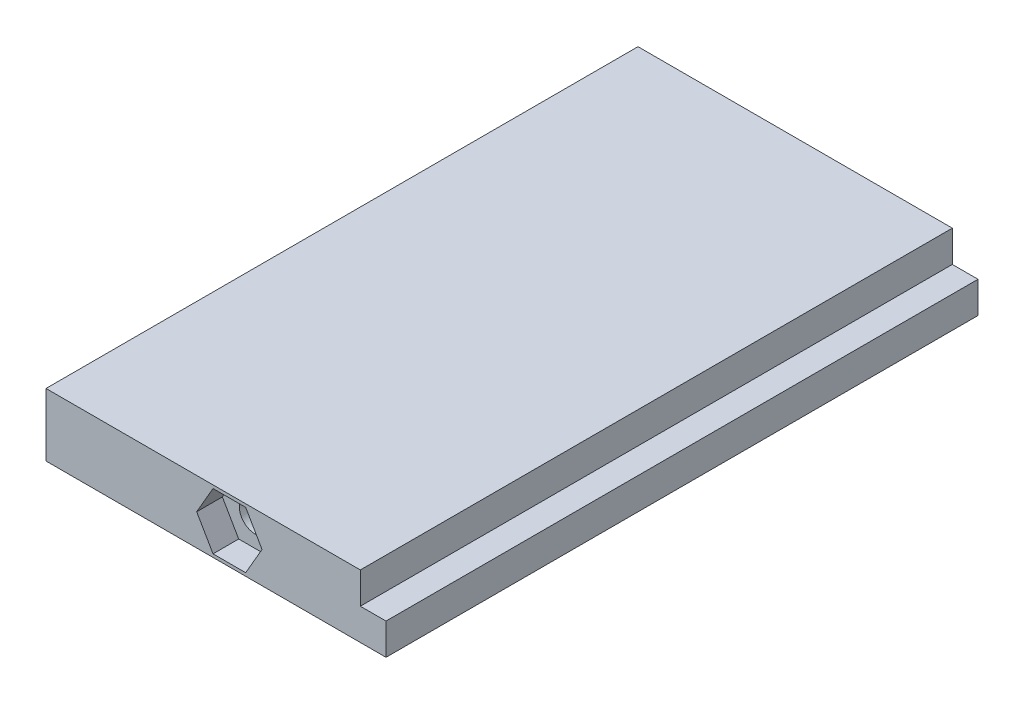
ISO-10303-21;
HEADER;
FILE_DESCRIPTION(('STEP AP214'),'2;1');
FILE_NAME('part.step','',(''),(''),'','','');
FILE_SCHEMA(('AUTOMOTIVE_DESIGN { 1 0 10303 214 1 1 1 1 }'));
ENDSEC;
DATA;
#1=APPLICATION_CONTEXT('core data for automotive mechanical design processes');
#2=APPLICATION_PROTOCOL_DEFINITION('international standard','automotive_design',2000,#1);
#3=PRODUCT_CONTEXT('',#1,'mechanical');
#4=PRODUCT('Part','Part','',(#3));
#5=PRODUCT_RELATED_PRODUCT_CATEGORY('part','',(#4));
#6=PRODUCT_DEFINITION_FORMATION('','',#4);
#7=PRODUCT_DEFINITION_CONTEXT('part definition',#1,'design');
#8=PRODUCT_DEFINITION('design','',#6,#7);
#9=PRODUCT_DEFINITION_SHAPE('','',#8);
#10=(LENGTH_UNIT() NAMED_UNIT(*) SI_UNIT(.MILLI.,.METRE.));
#11=(NAMED_UNIT(*) PLANE_ANGLE_UNIT() SI_UNIT($,.RADIAN.));
#12=(NAMED_UNIT(*) SI_UNIT($,.STERADIAN.) SOLID_ANGLE_UNIT());
#13=UNCERTAINTY_MEASURE_WITH_UNIT(LENGTH_MEASURE(1.E-05),#10,'distance_accuracy_value','');
#14=(GEOMETRIC_REPRESENTATION_CONTEXT(3) GLOBAL_UNCERTAINTY_ASSIGNED_CONTEXT((#13)) GLOBAL_UNIT_ASSIGNED_CONTEXT((#10,
#11,#12)) REPRESENTATION_CONTEXT('',''));
#15=CARTESIAN_POINT('',(0.,0.,0.));
#16=DIRECTION('',(0.,0.,1.));
#17=DIRECTION('',(1.,0.,0.));
#18=AXIS2_PLACEMENT_3D('',#15,#16,#17);
#19=CARTESIAN_POINT('',(2.49999999999999,3.,28.25));
#20=DIRECTION('',(0.,0.,-1.));
#21=DIRECTION('',(-1.,0.,0.));
#22=AXIS2_PLACEMENT_3D('',#19,#20,#21);
#23=CYLINDRICAL_SURFACE('',#22,1.5);
#24=CARTESIAN_POINT('',(2.49999999999999,3.,-25.8));
#25=DIRECTION('',(0.,0.,-1.));
#26=DIRECTION('',(-1.,0.,0.));
#27=AXIS2_PLACEMENT_3D('',#24,#25,#26);
#28=CIRCLE('',#27,1.5);
#29=CARTESIAN_POINT('',(0.999999999999993,3.,-25.8));
#30=VERTEX_POINT('',#29);
#31=EDGE_CURVE('E269',#30,#30,#28,.F.);
#32=ORIENTED_EDGE('',*,*,#31,.F.);
#33=EDGE_LOOP('',(#32));
#34=FACE_BOUND('',#33,.T.);
#35=CARTESIAN_POINT('',(2.49999999999999,3.,25.8));
#36=DIRECTION('',(0.,0.,1.));
#37=DIRECTION('',(1.,0.,0.));
#38=AXIS2_PLACEMENT_3D('',#35,#36,#37);
#39=CIRCLE('',#38,1.5);
#40=CARTESIAN_POINT('',(3.99999999999999,3.,25.8));
#41=VERTEX_POINT('',#40);
#42=EDGE_CURVE('E55',#41,#41,#39,.F.);
#43=ORIENTED_EDGE('',*,*,#42,.F.);
#44=EDGE_LOOP('',(#43));
#45=FACE_BOUND('',#44,.T.);
#46=ADVANCED_FACE('F51',(#34,#45),#23,.F.);
#47=CARTESIAN_POINT('',(-15.,6.,28.25));
#48=DIRECTION('',(0.,0.,-1.));
#49=DIRECTION('',(-1.,0.,0.));
#50=AXIS2_PLACEMENT_3D('',#47,#48,#49);
#51=PLANE('',#50);
#52=DIRECTION('',(1.,0.,0.));
#53=VECTOR('',#52,1.);
#54=CARTESIAN_POINT('',(-15.,0.,28.25));
#55=LINE('',#54,#53);
#56=CARTESIAN_POINT('',(-15.,0.,28.25));
#57=VERTEX_POINT('',#56);
#58=CARTESIAN_POINT('',(17.45,0.,28.25));
#59=VERTEX_POINT('',#58);
#60=EDGE_CURVE('E312',#57,#59,#55,.T.);
#61=ORIENTED_EDGE('',*,*,#60,.T.);
#62=DIRECTION('',(0.,-1.,0.));
#63=VECTOR('',#62,1.);
#64=CARTESIAN_POINT('',(17.45,3.,28.25));
#65=LINE('',#64,#63);
#66=CARTESIAN_POINT('',(17.45,3.,28.25));
#67=VERTEX_POINT('',#66);
#68=EDGE_CURVE('E279',#67,#59,#65,.T.);
#69=ORIENTED_EDGE('',*,*,#68,.F.);
#70=DIRECTION('',(-1.,0.,0.));
#71=VECTOR('',#70,1.);
#72=CARTESIAN_POINT('',(17.45,3.,28.25));
#73=LINE('',#72,#71);
#74=CARTESIAN_POINT('',(15.,3.,28.25));
#75=VERTEX_POINT('',#74);
#76=EDGE_CURVE('E290',#67,#75,#73,.T.);
#77=ORIENTED_EDGE('',*,*,#76,.T.);
#78=DIRECTION('',(0.,-1.,0.));
#79=VECTOR('',#78,1.);
#80=CARTESIAN_POINT('',(15.,6.,28.25));
#81=LINE('',#80,#79);
#82=CARTESIAN_POINT('',(15.,6.,28.25));
#83=VERTEX_POINT('',#82);
#84=EDGE_CURVE('E60',#83,#75,#81,.T.);
#85=ORIENTED_EDGE('',*,*,#84,.F.);
#86=DIRECTION('',(1.,0.,0.));
#87=VECTOR('',#86,1.);
#88=CARTESIAN_POINT('',(-15.,6.,28.25));
#89=LINE('',#88,#87);
#90=CARTESIAN_POINT('',(-15.,6.,28.25));
#91=VERTEX_POINT('',#90);
#92=EDGE_CURVE('E302',#91,#83,#89,.T.);
#93=ORIENTED_EDGE('',*,*,#92,.F.);
#94=DIRECTION('',(0.,-1.,0.));
#95=VECTOR('',#94,1.);
#96=CARTESIAN_POINT('',(-15.,6.,28.25));
#97=LINE('',#96,#95);
#98=EDGE_CURVE('E13',#91,#57,#97,.T.);
#99=ORIENTED_EDGE('',*,*,#98,.T.);
#100=EDGE_LOOP('',(#61,#69,#77,#85,#93,#99));
#101=FACE_BOUND('',#100,.T.);
#102=DIRECTION('',(-1.,0.,0.));
#103=VECTOR('',#102,1.);
#104=CARTESIAN_POINT('',(4.05884572681198,0.299999999999999,28.25));
#105=LINE('',#104,#103);
#106=CARTESIAN_POINT('',(4.05884572681198,0.299999999999999,28.25));
#107=VERTEX_POINT('',#106);
#108=CARTESIAN_POINT('',(0.941154273188003,0.300000000000002,28.25));
#109=VERTEX_POINT('',#108);
#110=EDGE_CURVE('E68',#107,#109,#105,.T.);
#111=ORIENTED_EDGE('',*,*,#110,.T.);
#112=DIRECTION('',(-0.5,0.866025403784439,0.));
#113=VECTOR('',#112,1.);
#114=CARTESIAN_POINT('',(0.941154273188003,0.300000000000002,28.25));
#115=LINE('',#114,#113);
#116=CARTESIAN_POINT('',(-0.617691453623986,3.,28.25));
#117=VERTEX_POINT('',#116);
#118=EDGE_CURVE('E200',#109,#117,#115,.T.);
#119=ORIENTED_EDGE('',*,*,#118,.T.);
#120=DIRECTION('',(0.500000000000001,0.866025403784438,0.));
#121=VECTOR('',#120,1.);
#122=CARTESIAN_POINT('',(-0.617691453623986,3.,28.25));
#123=LINE('',#122,#121);
#124=CARTESIAN_POINT('',(0.941154273188006,5.7,28.25));
#125=VERTEX_POINT('',#124);
#126=EDGE_CURVE('E203',#117,#125,#123,.T.);
#127=ORIENTED_EDGE('',*,*,#126,.T.);
#128=DIRECTION('',(1.,0.,0.));
#129=VECTOR('',#128,1.);
#130=CARTESIAN_POINT('',(0.941154273188006,5.7,28.25));
#131=LINE('',#130,#129);
#132=CARTESIAN_POINT('',(4.05884572681198,5.7,28.25));
#133=VERTEX_POINT('',#132);
#134=EDGE_CURVE('E218',#125,#133,#131,.T.);
#135=ORIENTED_EDGE('',*,*,#134,.T.);
#136=DIRECTION('',(0.5,-0.866025403784439,0.));
#137=VECTOR('',#136,1.);
#138=CARTESIAN_POINT('',(4.05884572681198,5.7,28.25));
#139=LINE('',#138,#137);
#140=CARTESIAN_POINT('',(5.61769145362397,3.,28.25));
#141=VERTEX_POINT('',#140);
#142=EDGE_CURVE('E215',#133,#141,#139,.T.);
#143=ORIENTED_EDGE('',*,*,#142,.T.);
#144=DIRECTION('',(-0.500000000000001,-0.866025403784438,0.));
#145=VECTOR('',#144,1.);
#146=CARTESIAN_POINT('',(5.61769145362397,3.,28.25));
#147=LINE('',#146,#145);
#148=EDGE_CURVE('E213',#141,#107,#147,.T.);
#149=ORIENTED_EDGE('',*,*,#148,.T.);
#150=EDGE_LOOP('',(#111,#119,#127,#135,#143,#149));
#151=FACE_BOUND('',#150,.T.);
#152=ADVANCED_FACE('F327',(#101,#151),#51,.F.);
#153=CARTESIAN_POINT('',(15.,6.,-28.25));
#154=DIRECTION('',(-1.,0.,0.));
#155=DIRECTION('',(0.,0.,1.));
#156=AXIS2_PLACEMENT_3D('',#153,#154,#155);
#157=PLANE('',#156);
#158=DIRECTION('',(0.,0.,1.));
#159=VECTOR('',#158,1.);
#160=CARTESIAN_POINT('',(15.,3.,28.25));
#161=LINE('',#160,#159);
#162=CARTESIAN_POINT('',(15.,3.,-28.25));
#163=VERTEX_POINT('',#162);
#164=EDGE_CURVE('E283',#163,#75,#161,.T.);
#165=ORIENTED_EDGE('',*,*,#164,.F.);
#166=DIRECTION('',(0.,-1.,0.));
#167=VECTOR('',#166,1.);
#168=CARTESIAN_POINT('',(15.,6.,-28.25));
#169=LINE('',#168,#167);
#170=CARTESIAN_POINT('',(15.,6.,-28.25));
#171=VERTEX_POINT('',#170);
#172=EDGE_CURVE('E317',#171,#163,#169,.T.);
#173=ORIENTED_EDGE('',*,*,#172,.F.);
#174=DIRECTION('',(0.,0.,-1.));
#175=VECTOR('',#174,1.);
#176=CARTESIAN_POINT('',(15.,6.,-28.25));
#177=LINE('',#176,#175);
#178=EDGE_CURVE('E305',#83,#171,#177,.T.);
#179=ORIENTED_EDGE('',*,*,#178,.F.);
#180=ORIENTED_EDGE('',*,*,#84,.T.);
#181=EDGE_LOOP('',(#165,#173,#179,#180));
#182=FACE_BOUND('',#181,.T.);
#183=ADVANCED_FACE('F403',(#182),#157,.F.);
#184=CARTESIAN_POINT('',(-15.,6.,-28.25));
#185=DIRECTION('',(1.,0.,0.));
#186=DIRECTION('',(0.,0.,-1.));
#187=AXIS2_PLACEMENT_3D('',#184,#185,#186);
#188=PLANE('',#187);
#189=DIRECTION('',(0.,0.,1.));
#190=VECTOR('',#189,1.);
#191=CARTESIAN_POINT('',(-15.,0.,-28.25));
#192=LINE('',#191,#190);
#193=CARTESIAN_POINT('',(-15.,0.,-28.25));
#194=VERTEX_POINT('',#193);
#195=EDGE_CURVE('E298',#194,#57,#192,.T.);
#196=ORIENTED_EDGE('',*,*,#195,.T.);
#197=ORIENTED_EDGE('',*,*,#98,.F.);
#198=DIRECTION('',(0.,0.,1.));
#199=VECTOR('',#198,1.);
#200=CARTESIAN_POINT('',(-15.,6.,-28.25));
#201=LINE('',#200,#199);
#202=CARTESIAN_POINT('',(-15.,6.,-28.25));
#203=VERTEX_POINT('',#202);
#204=EDGE_CURVE('E299',#203,#91,#201,.T.);
#205=ORIENTED_EDGE('',*,*,#204,.F.);
#206=DIRECTION('',(0.,-1.,0.));
#207=VECTOR('',#206,1.);
#208=CARTESIAN_POINT('',(-15.,6.,-28.25));
#209=LINE('',#208,#207);
#210=EDGE_CURVE('E309',#203,#194,#209,.T.);
#211=ORIENTED_EDGE('',*,*,#210,.T.);
#212=EDGE_LOOP('',(#196,#197,#205,#211));
#213=FACE_BOUND('',#212,.T.);
#214=ADVANCED_FACE('F53',(#213),#188,.F.);
#215=CARTESIAN_POINT('',(-15.,6.,-28.25));
#216=DIRECTION('',(0.,0.,1.));
#217=DIRECTION('',(1.,0.,0.));
#218=AXIS2_PLACEMENT_3D('',#215,#216,#217);
#219=PLANE('',#218);
#220=DIRECTION('',(-0.5,0.866025403784439,0.));
#221=VECTOR('',#220,1.);
#222=CARTESIAN_POINT('',(0.941154273188003,0.300000000000002,-28.25));
#223=LINE('',#222,#221);
#224=CARTESIAN_POINT('',(0.941154273188004,0.300000000000003,-28.25));
#225=VERTEX_POINT('',#224);
#226=CARTESIAN_POINT('',(-0.617691453623986,3.,-28.25));
#227=VERTEX_POINT('',#226);
#228=EDGE_CURVE('E253',#225,#227,#223,.T.);
#229=ORIENTED_EDGE('',*,*,#228,.F.);
#230=DIRECTION('',(-1.,0.,0.));
#231=VECTOR('',#230,1.);
#232=CARTESIAN_POINT('',(4.05884572681198,0.299999999999999,-28.25));
#233=LINE('',#232,#231);
#234=CARTESIAN_POINT('',(4.05884572681198,0.299999999999999,-28.25));
#235=VERTEX_POINT('',#234);
#236=EDGE_CURVE('E76',#235,#225,#233,.T.);
#237=ORIENTED_EDGE('',*,*,#236,.F.);
#238=DIRECTION('',(-0.500000000000001,-0.866025403784438,0.));
#239=VECTOR('',#238,1.);
#240=CARTESIAN_POINT('',(5.61769145362397,3.,-28.25));
#241=LINE('',#240,#239);
#242=CARTESIAN_POINT('',(5.61769145362397,3.,-28.25));
#243=VERTEX_POINT('',#242);
#244=EDGE_CURVE('E236',#243,#235,#241,.T.);
#245=ORIENTED_EDGE('',*,*,#244,.F.);
#246=DIRECTION('',(0.5,-0.866025403784439,0.));
#247=VECTOR('',#246,1.);
#248=CARTESIAN_POINT('',(4.05884572681198,5.7,-28.25));
#249=LINE('',#248,#247);
#250=CARTESIAN_POINT('',(4.05884572681198,5.7,-28.25));
#251=VERTEX_POINT('',#250);
#252=EDGE_CURVE('E262',#251,#243,#249,.T.);
#253=ORIENTED_EDGE('',*,*,#252,.F.);
#254=DIRECTION('',(1.,0.,0.));
#255=VECTOR('',#254,1.);
#256=CARTESIAN_POINT('',(0.941154273188006,5.7,-28.25));
#257=LINE('',#256,#255);
#258=CARTESIAN_POINT('',(0.941154273188006,5.7,-28.25));
#259=VERTEX_POINT('',#258);
#260=EDGE_CURVE('E259',#259,#251,#257,.T.);
#261=ORIENTED_EDGE('',*,*,#260,.F.);
#262=DIRECTION('',(0.500000000000001,0.866025403784438,0.));
#263=VECTOR('',#262,1.);
#264=CARTESIAN_POINT('',(-0.617691453623986,3.,-28.25));
#265=LINE('',#264,#263);
#266=EDGE_CURVE('E256',#227,#259,#265,.T.);
#267=ORIENTED_EDGE('',*,*,#266,.F.);
#268=EDGE_LOOP('',(#229,#237,#245,#253,#261,#267));
#269=FACE_BOUND('',#268,.T.);
#270=DIRECTION('',(-1.,0.,0.));
#271=VECTOR('',#270,1.);
#272=CARTESIAN_POINT('',(-15.,0.,-28.25));
#273=LINE('',#272,#271);
#274=CARTESIAN_POINT('',(17.45,0.,-28.25));
#275=VERTEX_POINT('',#274);
#276=EDGE_CURVE('E303',#275,#194,#273,.T.);
#277=ORIENTED_EDGE('',*,*,#276,.T.);
#278=ORIENTED_EDGE('',*,*,#210,.F.);
#279=DIRECTION('',(-1.,0.,0.));
#280=VECTOR('',#279,1.);
#281=CARTESIAN_POINT('',(-15.,6.,-28.25));
#282=LINE('',#281,#280);
#283=EDGE_CURVE('E307',#171,#203,#282,.T.);
#284=ORIENTED_EDGE('',*,*,#283,.F.);
#285=ORIENTED_EDGE('',*,*,#172,.T.);
#286=DIRECTION('',(-1.,0.,0.));
#287=VECTOR('',#286,1.);
#288=CARTESIAN_POINT('',(17.45,3.,-28.25));
#289=LINE('',#288,#287);
#290=CARTESIAN_POINT('',(17.45,3.,-28.25));
#291=VERTEX_POINT('',#290);
#292=EDGE_CURVE('E295',#291,#163,#289,.T.);
#293=ORIENTED_EDGE('',*,*,#292,.F.);
#294=DIRECTION('',(0.,1.,0.));
#295=VECTOR('',#294,1.);
#296=CARTESIAN_POINT('',(17.45,3.,-28.25));
#297=LINE('',#296,#295);
#298=EDGE_CURVE('E286',#275,#291,#297,.T.);
#299=ORIENTED_EDGE('',*,*,#298,.F.);
#300=EDGE_LOOP('',(#277,#278,#284,#285,#293,#299));
#301=FACE_BOUND('',#300,.T.);
#302=ADVANCED_FACE('F395',(#269,#301),#219,.F.);
#303=CARTESIAN_POINT('',(0.,6.,0.));
#304=DIRECTION('',(0.,1.,0.));
#305=DIRECTION('',(0.,0.,1.));
#306=AXIS2_PLACEMENT_3D('',#303,#304,#305);
#307=PLANE('',#306);
#308=ORIENTED_EDGE('',*,*,#204,.T.);
#309=ORIENTED_EDGE('',*,*,#92,.T.);
#310=ORIENTED_EDGE('',*,*,#178,.T.);
#311=ORIENTED_EDGE('',*,*,#283,.T.);
#312=EDGE_LOOP('',(#308,#309,#310,#311));
#313=FACE_BOUND('',#312,.T.);
#314=ADVANCED_FACE('F392',(#313),#307,.T.);
#315=CARTESIAN_POINT('',(0.,0.,0.));
#316=DIRECTION('',(0.,1.,0.));
#317=DIRECTION('',(0.,0.,1.));
#318=AXIS2_PLACEMENT_3D('',#315,#316,#317);
#319=PLANE('',#318);
#320=ORIENTED_EDGE('',*,*,#195,.F.);
#321=ORIENTED_EDGE('',*,*,#276,.F.);
#322=DIRECTION('',(0.,0.,-1.));
#323=VECTOR('',#322,1.);
#324=CARTESIAN_POINT('',(17.45,0.,28.25));
#325=LINE('',#324,#323);
#326=EDGE_CURVE('E282',#59,#275,#325,.T.);
#327=ORIENTED_EDGE('',*,*,#326,.F.);
#328=ORIENTED_EDGE('',*,*,#60,.F.);
#329=EDGE_LOOP('',(#320,#321,#327,#328));
#330=FACE_BOUND('',#329,.T.);
#331=ADVANCED_FACE('F390',(#330),#319,.F.);
#332=CARTESIAN_POINT('',(17.45,3.,28.25));
#333=DIRECTION('',(0.,-1.,0.));
#334=DIRECTION('',(0.,0.,-1.));
#335=AXIS2_PLACEMENT_3D('',#332,#333,#334);
#336=PLANE('',#335);
#337=ORIENTED_EDGE('',*,*,#164,.T.);
#338=ORIENTED_EDGE('',*,*,#76,.F.);
#339=DIRECTION('',(0.,0.,1.));
#340=VECTOR('',#339,1.);
#341=CARTESIAN_POINT('',(17.45,3.,28.25));
#342=LINE('',#341,#340);
#343=EDGE_CURVE('E288',#291,#67,#342,.T.);
#344=ORIENTED_EDGE('',*,*,#343,.F.);
#345=ORIENTED_EDGE('',*,*,#292,.T.);
#346=EDGE_LOOP('',(#337,#338,#344,#345));
#347=FACE_BOUND('',#346,.T.);
#348=ADVANCED_FACE('F386',(#347),#336,.F.);
#349=CARTESIAN_POINT('',(17.45,0.,0.));
#350=DIRECTION('',(1.,0.,0.));
#351=DIRECTION('',(0.,0.,-1.));
#352=AXIS2_PLACEMENT_3D('',#349,#350,#351);
#353=PLANE('',#352);
#354=ORIENTED_EDGE('',*,*,#68,.T.);
#355=ORIENTED_EDGE('',*,*,#326,.T.);
#356=ORIENTED_EDGE('',*,*,#298,.T.);
#357=ORIENTED_EDGE('',*,*,#343,.T.);
#358=EDGE_LOOP('',(#354,#355,#356,#357));
#359=FACE_BOUND('',#358,.T.);
#360=ADVANCED_FACE('F365',(#359),#353,.T.);
#361=CARTESIAN_POINT('',(0.,0.,-25.8));
#362=DIRECTION('',(0.,0.,-1.));
#363=DIRECTION('',(-1.,0.,0.));
#364=AXIS2_PLACEMENT_3D('',#361,#362,#363);
#365=PLANE('',#364);
#366=DIRECTION('',(-1.,0.,0.));
#367=VECTOR('',#366,1.);
#368=CARTESIAN_POINT('',(4.05884572681198,0.299999999999999,-25.8));
#369=LINE('',#368,#367);
#370=CARTESIAN_POINT('',(4.05884572681198,0.299999999999999,-25.8));
#371=VERTEX_POINT('',#370);
#372=CARTESIAN_POINT('',(0.941154273188003,0.300000000000002,-25.8));
#373=VERTEX_POINT('',#372);
#374=EDGE_CURVE('E232',#371,#373,#369,.T.);
#375=ORIENTED_EDGE('',*,*,#374,.T.);
#376=DIRECTION('',(-0.5,0.866025403784439,0.));
#377=VECTOR('',#376,1.);
#378=CARTESIAN_POINT('',(0.941154273188003,0.300000000000002,-25.8));
#379=LINE('',#378,#377);
#380=CARTESIAN_POINT('',(-0.617691453623986,3.,-25.8));
#381=VERTEX_POINT('',#380);
#382=EDGE_CURVE('E235',#373,#381,#379,.T.);
#383=ORIENTED_EDGE('',*,*,#382,.T.);
#384=DIRECTION('',(0.500000000000001,0.866025403784438,0.));
#385=VECTOR('',#384,1.);
#386=CARTESIAN_POINT('',(-0.617691453623986,3.,-25.8));
#387=LINE('',#386,#385);
#388=CARTESIAN_POINT('',(0.941154273188006,5.7,-25.8));
#389=VERTEX_POINT('',#388);
#390=EDGE_CURVE('E239',#381,#389,#387,.T.);
#391=ORIENTED_EDGE('',*,*,#390,.T.);
#392=DIRECTION('',(1.,0.,0.));
#393=VECTOR('',#392,1.);
#394=CARTESIAN_POINT('',(0.941154273188006,5.7,-25.8));
#395=LINE('',#394,#393);
#396=CARTESIAN_POINT('',(4.05884572681198,5.7,-25.8));
#397=VERTEX_POINT('',#396);
#398=EDGE_CURVE('E242',#389,#397,#395,.T.);
#399=ORIENTED_EDGE('',*,*,#398,.T.);
#400=DIRECTION('',(0.5,-0.866025403784439,0.));
#401=VECTOR('',#400,1.);
#402=CARTESIAN_POINT('',(4.05884572681198,5.7,-25.8));
#403=LINE('',#402,#401);
#404=CARTESIAN_POINT('',(5.61769145362397,3.,-25.8));
#405=VERTEX_POINT('',#404);
#406=EDGE_CURVE('E245',#397,#405,#403,.T.);
#407=ORIENTED_EDGE('',*,*,#406,.T.);
#408=DIRECTION('',(-0.500000000000001,-0.866025403784438,0.));
#409=VECTOR('',#408,1.);
#410=CARTESIAN_POINT('',(5.61769145362397,3.,-25.8));
#411=LINE('',#410,#409);
#412=EDGE_CURVE('E248',#405,#371,#411,.T.);
#413=ORIENTED_EDGE('',*,*,#412,.T.);
#414=EDGE_LOOP('',(#375,#383,#391,#399,#407,#413));
#415=FACE_BOUND('',#414,.T.);
#416=ORIENTED_EDGE('',*,*,#31,.T.);
#417=EDGE_LOOP('',(#416));
#418=FACE_BOUND('',#417,.T.);
#419=ADVANCED_FACE('F323',(#415,#418),#365,.T.);
#420=CARTESIAN_POINT('',(4.05884572681198,0.299999999999999,-25.8));
#421=DIRECTION('',(0.,-1.,0.));
#422=DIRECTION('',(1.,0.,0.));
#423=AXIS2_PLACEMENT_3D('',#420,#421,#422);
#424=PLANE('',#423);
#425=ORIENTED_EDGE('',*,*,#236,.T.);
#426=DIRECTION('',(0.,0.,-1.));
#427=VECTOR('',#426,1.);
#428=CARTESIAN_POINT('',(0.941154273188003,0.300000000000002,-25.8));
#429=LINE('',#428,#427);
#430=EDGE_CURVE('E251',#373,#225,#429,.T.);
#431=ORIENTED_EDGE('',*,*,#430,.F.);
#432=ORIENTED_EDGE('',*,*,#374,.F.);
#433=DIRECTION('',(0.,0.,-1.));
#434=VECTOR('',#433,1.);
#435=CARTESIAN_POINT('',(4.05884572681198,0.299999999999999,-25.8));
#436=LINE('',#435,#434);
#437=EDGE_CURVE('E267',#371,#235,#436,.T.);
#438=ORIENTED_EDGE('',*,*,#437,.T.);
#439=EDGE_LOOP('',(#425,#431,#432,#438));
#440=FACE_BOUND('',#439,.T.);
#441=ADVANCED_FACE('F364',(#440),#424,.F.);
#442=CARTESIAN_POINT('',(5.61769145362397,3.,-25.8));
#443=DIRECTION('',(0.866025403784438,-0.500000000000001,0.));
#444=DIRECTION('',(0.500000000000001,0.866025403784438,0.));
#445=AXIS2_PLACEMENT_3D('',#442,#443,#444);
#446=PLANE('',#445);
#447=ORIENTED_EDGE('',*,*,#244,.T.);
#448=ORIENTED_EDGE('',*,*,#437,.F.);
#449=ORIENTED_EDGE('',*,*,#412,.F.);
#450=DIRECTION('',(0.,0.,-1.));
#451=VECTOR('',#450,1.);
#452=CARTESIAN_POINT('',(5.61769145362397,3.,-25.8));
#453=LINE('',#452,#451);
#454=EDGE_CURVE('E270',#405,#243,#453,.T.);
#455=ORIENTED_EDGE('',*,*,#454,.T.);
#456=EDGE_LOOP('',(#447,#448,#449,#455));
#457=FACE_BOUND('',#456,.T.);
#458=ADVANCED_FACE('F367',(#457),#446,.F.);
#459=CARTESIAN_POINT('',(4.05884572681198,5.7,-25.8));
#460=DIRECTION('',(0.866025403784439,0.5,0.));
#461=DIRECTION('',(-0.5,0.866025403784439,0.));
#462=AXIS2_PLACEMENT_3D('',#459,#460,#461);
#463=PLANE('',#462);
#464=ORIENTED_EDGE('',*,*,#252,.T.);
#465=ORIENTED_EDGE('',*,*,#454,.F.);
#466=ORIENTED_EDGE('',*,*,#406,.F.);
#467=DIRECTION('',(0.,0.,-1.));
#468=VECTOR('',#467,1.);
#469=CARTESIAN_POINT('',(4.05884572681198,5.7,-25.8));
#470=LINE('',#469,#468);
#471=EDGE_CURVE('E272',#397,#251,#470,.T.);
#472=ORIENTED_EDGE('',*,*,#471,.T.);
#473=EDGE_LOOP('',(#464,#465,#466,#472));
#474=FACE_BOUND('',#473,.T.);
#475=ADVANCED_FACE('F370',(#474),#463,.F.);
#476=CARTESIAN_POINT('',(0.941154273188006,5.7,-25.8));
#477=DIRECTION('',(0.,1.,0.));
#478=DIRECTION('',(-1.,0.,0.));
#479=AXIS2_PLACEMENT_3D('',#476,#477,#478);
#480=PLANE('',#479);
#481=ORIENTED_EDGE('',*,*,#260,.T.);
#482=ORIENTED_EDGE('',*,*,#471,.F.);
#483=ORIENTED_EDGE('',*,*,#398,.F.);
#484=DIRECTION('',(0.,0.,-1.));
#485=VECTOR('',#484,1.);
#486=CARTESIAN_POINT('',(0.941154273188006,5.7,-25.8));
#487=LINE('',#486,#485);
#488=EDGE_CURVE('E274',#389,#259,#487,.T.);
#489=ORIENTED_EDGE('',*,*,#488,.T.);
#490=EDGE_LOOP('',(#481,#482,#483,#489));
#491=FACE_BOUND('',#490,.T.);
#492=ADVANCED_FACE('F374',(#491),#480,.F.);
#493=CARTESIAN_POINT('',(-0.617691453623986,3.,-25.8));
#494=DIRECTION('',(-0.866025403784438,0.500000000000001,0.));
#495=DIRECTION('',(-0.500000000000001,-0.866025403784438,0.));
#496=AXIS2_PLACEMENT_3D('',#493,#494,#495);
#497=PLANE('',#496);
#498=ORIENTED_EDGE('',*,*,#266,.T.);
#499=ORIENTED_EDGE('',*,*,#488,.F.);
#500=ORIENTED_EDGE('',*,*,#390,.F.);
#501=DIRECTION('',(0.,0.,-1.));
#502=VECTOR('',#501,1.);
#503=CARTESIAN_POINT('',(-0.617691453623986,3.,-25.8));
#504=LINE('',#503,#502);
#505=EDGE_CURVE('E276',#381,#227,#504,.T.);
#506=ORIENTED_EDGE('',*,*,#505,.T.);
#507=EDGE_LOOP('',(#498,#499,#500,#506));
#508=FACE_BOUND('',#507,.T.);
#509=ADVANCED_FACE('F341',(#508),#497,.F.);
#510=CARTESIAN_POINT('',(0.941154273188003,0.300000000000002,-25.8));
#511=DIRECTION('',(-0.866025403784439,-0.5,0.));
#512=DIRECTION('',(0.5,-0.866025403784439,0.));
#513=AXIS2_PLACEMENT_3D('',#510,#511,#512);
#514=PLANE('',#513);
#515=ORIENTED_EDGE('',*,*,#228,.T.);
#516=ORIENTED_EDGE('',*,*,#505,.F.);
#517=ORIENTED_EDGE('',*,*,#382,.F.);
#518=ORIENTED_EDGE('',*,*,#430,.T.);
#519=EDGE_LOOP('',(#515,#516,#517,#518));
#520=FACE_BOUND('',#519,.T.);
#521=ADVANCED_FACE('F332',(#520),#514,.F.);
#522=CARTESIAN_POINT('',(0.,0.,25.8));
#523=DIRECTION('',(0.,0.,1.));
#524=DIRECTION('',(-1.,0.,0.));
#525=AXIS2_PLACEMENT_3D('',#522,#523,#524);
#526=PLANE('',#525);
#527=DIRECTION('',(-1.,0.,0.));
#528=VECTOR('',#527,1.);
#529=CARTESIAN_POINT('',(4.05884572681198,0.299999999999999,25.8));
#530=LINE('',#529,#528);
#531=CARTESIAN_POINT('',(4.05884572681198,0.299999999999999,25.8));
#532=VERTEX_POINT('',#531);
#533=CARTESIAN_POINT('',(0.941154273188003,0.300000000000002,25.8));
#534=VERTEX_POINT('',#533);
#535=EDGE_CURVE('E190',#532,#534,#530,.T.);
#536=ORIENTED_EDGE('',*,*,#535,.F.);
#537=DIRECTION('',(-0.500000000000001,-0.866025403784438,0.));
#538=VECTOR('',#537,1.);
#539=CARTESIAN_POINT('',(5.61769145362397,3.,25.8));
#540=LINE('',#539,#538);
#541=CARTESIAN_POINT('',(5.61769145362397,3.,25.8));
#542=VERTEX_POINT('',#541);
#543=EDGE_CURVE('E180',#542,#532,#540,.T.);
#544=ORIENTED_EDGE('',*,*,#543,.F.);
#545=DIRECTION('',(0.5,-0.866025403784439,0.));
#546=VECTOR('',#545,1.);
#547=CARTESIAN_POINT('',(4.05884572681198,5.7,25.8));
#548=LINE('',#547,#546);
#549=CARTESIAN_POINT('',(4.05884572681198,5.7,25.8));
#550=VERTEX_POINT('',#549);
#551=EDGE_CURVE('E189',#550,#542,#548,.T.);
#552=ORIENTED_EDGE('',*,*,#551,.F.);
#553=DIRECTION('',(1.,0.,0.));
#554=VECTOR('',#553,1.);
#555=CARTESIAN_POINT('',(0.941154273188006,5.7,25.8));
#556=LINE('',#555,#554);
#557=CARTESIAN_POINT('',(0.941154273188006,5.7,25.8));
#558=VERTEX_POINT('',#557);
#559=EDGE_CURVE('E207',#558,#550,#556,.T.);
#560=ORIENTED_EDGE('',*,*,#559,.F.);
#561=DIRECTION('',(0.500000000000001,0.866025403784438,0.));
#562=VECTOR('',#561,1.);
#563=CARTESIAN_POINT('',(-0.617691453623986,3.,25.8));
#564=LINE('',#563,#562);
#565=CARTESIAN_POINT('',(-0.617691453623986,3.,25.8));
#566=VERTEX_POINT('',#565);
#567=EDGE_CURVE('E209',#566,#558,#564,.T.);
#568=ORIENTED_EDGE('',*,*,#567,.F.);
#569=DIRECTION('',(-0.5,0.866025403784439,0.));
#570=VECTOR('',#569,1.);
#571=CARTESIAN_POINT('',(0.941154273188003,0.300000000000002,25.8));
#572=LINE('',#571,#570);
#573=EDGE_CURVE('E195',#534,#566,#572,.T.);
#574=ORIENTED_EDGE('',*,*,#573,.F.);
#575=EDGE_LOOP('',(#536,#544,#552,#560,#568,#574));
#576=FACE_BOUND('',#575,.T.);
#577=ORIENTED_EDGE('',*,*,#42,.T.);
#578=EDGE_LOOP('',(#577));
#579=FACE_BOUND('',#578,.T.);
#580=ADVANCED_FACE('F197',(#576,#579),#526,.T.);
#581=CARTESIAN_POINT('',(4.05884572681198,0.299999999999999,25.8));
#582=DIRECTION('',(0.,1.,0.));
#583=DIRECTION('',(-1.,0.,0.));
#584=AXIS2_PLACEMENT_3D('',#581,#582,#583);
#585=PLANE('',#584);
#586=ORIENTED_EDGE('',*,*,#110,.F.);
#587=DIRECTION('',(0.,0.,1.));
#588=VECTOR('',#587,1.);
#589=CARTESIAN_POINT('',(4.05884572681198,0.299999999999999,25.8));
#590=LINE('',#589,#588);
#591=EDGE_CURVE('E183',#532,#107,#590,.T.);
#592=ORIENTED_EDGE('',*,*,#591,.F.);
#593=ORIENTED_EDGE('',*,*,#535,.T.);
#594=DIRECTION('',(0.,0.,1.));
#595=VECTOR('',#594,1.);
#596=CARTESIAN_POINT('',(0.941154273188003,0.300000000000002,25.8));
#597=LINE('',#596,#595);
#598=EDGE_CURVE('E223',#534,#109,#597,.T.);
#599=ORIENTED_EDGE('',*,*,#598,.T.);
#600=EDGE_LOOP('',(#586,#592,#593,#599));
#601=FACE_BOUND('',#600,.T.);
#602=ADVANCED_FACE('F193',(#601),#585,.T.);
#603=CARTESIAN_POINT('',(0.941154273188003,0.300000000000002,25.8));
#604=DIRECTION('',(0.866025403784439,0.5,0.));
#605=DIRECTION('',(-0.5,0.866025403784439,0.));
#606=AXIS2_PLACEMENT_3D('',#603,#604,#605);
#607=PLANE('',#606);
#608=ORIENTED_EDGE('',*,*,#118,.F.);
#609=ORIENTED_EDGE('',*,*,#598,.F.);
#610=ORIENTED_EDGE('',*,*,#573,.T.);
#611=DIRECTION('',(0.,0.,1.));
#612=VECTOR('',#611,1.);
#613=CARTESIAN_POINT('',(-0.617691453623986,3.,25.8));
#614=LINE('',#613,#612);
#615=EDGE_CURVE('E225',#566,#117,#614,.T.);
#616=ORIENTED_EDGE('',*,*,#615,.T.);
#617=EDGE_LOOP('',(#608,#609,#610,#616));
#618=FACE_BOUND('',#617,.T.);
#619=ADVANCED_FACE('F338',(#618),#607,.T.);
#620=CARTESIAN_POINT('',(-0.617691453623986,3.,25.8));
#621=DIRECTION('',(0.866025403784438,-0.500000000000001,0.));
#622=DIRECTION('',(0.500000000000001,0.866025403784438,0.));
#623=AXIS2_PLACEMENT_3D('',#620,#621,#622);
#624=PLANE('',#623);
#625=ORIENTED_EDGE('',*,*,#126,.F.);
#626=ORIENTED_EDGE('',*,*,#615,.F.);
#627=ORIENTED_EDGE('',*,*,#567,.T.);
#628=DIRECTION('',(0.,0.,1.));
#629=VECTOR('',#628,1.);
#630=CARTESIAN_POINT('',(0.941154273188006,5.7,25.8));
#631=LINE('',#630,#629);
#632=EDGE_CURVE('E227',#558,#125,#631,.T.);
#633=ORIENTED_EDGE('',*,*,#632,.T.);
#634=EDGE_LOOP('',(#625,#626,#627,#633));
#635=FACE_BOUND('',#634,.T.);
#636=ADVANCED_FACE('F347',(#635),#624,.T.);
#637=CARTESIAN_POINT('',(0.941154273188006,5.7,25.8));
#638=DIRECTION('',(0.,-1.,0.));
#639=DIRECTION('',(1.,0.,0.));
#640=AXIS2_PLACEMENT_3D('',#637,#638,#639);
#641=PLANE('',#640);
#642=ORIENTED_EDGE('',*,*,#134,.F.);
#643=ORIENTED_EDGE('',*,*,#632,.F.);
#644=ORIENTED_EDGE('',*,*,#559,.T.);
#645=DIRECTION('',(0.,0.,1.));
#646=VECTOR('',#645,1.);
#647=CARTESIAN_POINT('',(4.05884572681198,5.7,25.8));
#648=LINE('',#647,#646);
#649=EDGE_CURVE('E229',#550,#133,#648,.T.);
#650=ORIENTED_EDGE('',*,*,#649,.T.);
#651=EDGE_LOOP('',(#642,#643,#644,#650));
#652=FACE_BOUND('',#651,.T.);
#653=ADVANCED_FACE('F351',(#652),#641,.T.);
#654=CARTESIAN_POINT('',(4.05884572681198,5.7,25.8));
#655=DIRECTION('',(-0.866025403784439,-0.5,0.));
#656=DIRECTION('',(0.5,-0.866025403784439,0.));
#657=AXIS2_PLACEMENT_3D('',#654,#655,#656);
#658=PLANE('',#657);
#659=ORIENTED_EDGE('',*,*,#142,.F.);
#660=ORIENTED_EDGE('',*,*,#649,.F.);
#661=ORIENTED_EDGE('',*,*,#551,.T.);
#662=DIRECTION('',(0.,0.,1.));
#663=VECTOR('',#662,1.);
#664=CARTESIAN_POINT('',(5.61769145362397,3.,25.8));
#665=LINE('',#664,#663);
#666=EDGE_CURVE('E185',#542,#141,#665,.T.);
#667=ORIENTED_EDGE('',*,*,#666,.T.);
#668=EDGE_LOOP('',(#659,#660,#661,#667));
#669=FACE_BOUND('',#668,.T.);
#670=ADVANCED_FACE('F355',(#669),#658,.T.);
#671=CARTESIAN_POINT('',(5.61769145362397,3.,25.8));
#672=DIRECTION('',(-0.866025403784438,0.500000000000001,0.));
#673=DIRECTION('',(-0.500000000000001,-0.866025403784438,0.));
#674=AXIS2_PLACEMENT_3D('',#671,#672,#673);
#675=PLANE('',#674);
#676=ORIENTED_EDGE('',*,*,#148,.F.);
#677=ORIENTED_EDGE('',*,*,#666,.F.);
#678=ORIENTED_EDGE('',*,*,#543,.T.);
#679=ORIENTED_EDGE('',*,*,#591,.T.);
#680=EDGE_LOOP('',(#676,#677,#678,#679));
#681=FACE_BOUND('',#680,.T.);
#682=ADVANCED_FACE('F182',(#681),#675,.T.);
#683=CLOSED_SHELL('',(#46,#152,#183,#214,#302,#314,#331,#348,#360,#419,#441,#458,#475,#492,#509,
#521,#580,#602,#619,#636,#653,#670,#682));
#684=MANIFOLD_SOLID_BREP('B2',#683);
#685=ADVANCED_BREP_SHAPE_REPRESENTATION('',(#18,#684),#14);
#686=SHAPE_DEFINITION_REPRESENTATION(#9,#685);
ENDSEC;
END-ISO-10303-21;
